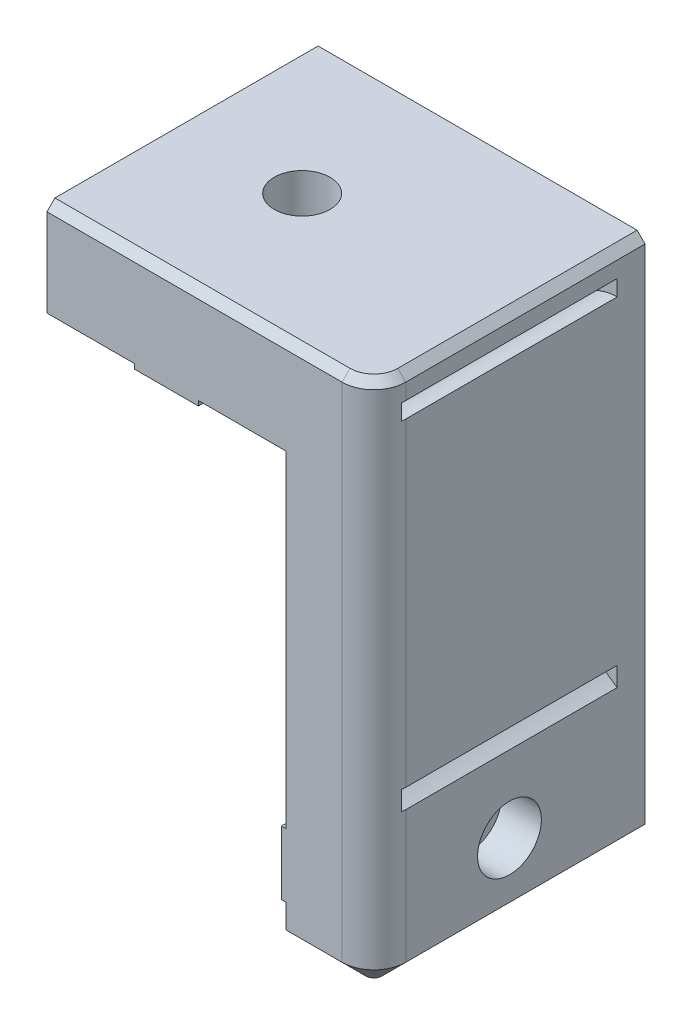
ISO-10303-21;
HEADER;
FILE_DESCRIPTION(('STEP AP214'),'2;1');
FILE_NAME('part.step','',(''),(''),'','','');
FILE_SCHEMA(('AUTOMOTIVE_DESIGN { 1 0 10303 214 1 1 1 1 }'));
ENDSEC;
DATA;
#1=APPLICATION_CONTEXT('core data for automotive mechanical design processes');
#2=APPLICATION_PROTOCOL_DEFINITION('international standard','automotive_design',2000,#1);
#3=PRODUCT_CONTEXT('',#1,'mechanical');
#4=PRODUCT('Part','Part','',(#3));
#5=PRODUCT_RELATED_PRODUCT_CATEGORY('part','',(#4));
#6=PRODUCT_DEFINITION_FORMATION('','',#4);
#7=PRODUCT_DEFINITION_CONTEXT('part definition',#1,'design');
#8=PRODUCT_DEFINITION('design','',#6,#7);
#9=PRODUCT_DEFINITION_SHAPE('','',#8);
#10=(LENGTH_UNIT() NAMED_UNIT(*) SI_UNIT(.MILLI.,.METRE.));
#11=(NAMED_UNIT(*) PLANE_ANGLE_UNIT() SI_UNIT($,.RADIAN.));
#12=(NAMED_UNIT(*) SI_UNIT($,.STERADIAN.) SOLID_ANGLE_UNIT());
#13=UNCERTAINTY_MEASURE_WITH_UNIT(LENGTH_MEASURE(1.E-05),#10,'distance_accuracy_value','');
#14=(GEOMETRIC_REPRESENTATION_CONTEXT(3) GLOBAL_UNCERTAINTY_ASSIGNED_CONTEXT((#13)) GLOBAL_UNIT_ASSIGNED_CONTEXT((#10,
#11,#12)) REPRESENTATION_CONTEXT('',''));
#15=CARTESIAN_POINT('',(0.,0.,0.));
#16=DIRECTION('',(0.,0.,1.));
#17=DIRECTION('',(1.,0.,0.));
#18=AXIS2_PLACEMENT_3D('',#15,#16,#17);
#19=CARTESIAN_POINT('',(-35.5,10.,0.));
#20=DIRECTION('',(1.,0.,0.));
#21=DIRECTION('',(0.,0.,-1.));
#22=AXIS2_PLACEMENT_3D('',#19,#20,#21);
#23=CYLINDRICAL_SURFACE('',#22,2.25);
#24=CARTESIAN_POINT('',(-6.1,10.,0.));
#25=DIRECTION('',(-1.,0.,0.));
#26=DIRECTION('',(0.,-1.,0.));
#27=AXIS2_PLACEMENT_3D('',#24,#25,#26);
#28=CIRCLE('',#27,2.25);
#29=CARTESIAN_POINT('',(-6.1,7.75,0.));
#30=VERTEX_POINT('',#29);
#31=EDGE_CURVE('E433',#30,#30,#28,.T.);
#32=ORIENTED_EDGE('',*,*,#31,.T.);
#33=EDGE_LOOP('',(#32));
#34=FACE_BOUND('',#33,.T.);
#35=CARTESIAN_POINT('',(0.5,10.,0.));
#36=DIRECTION('',(1.,0.,0.));
#37=DIRECTION('',(0.,0.,-1.));
#38=AXIS2_PLACEMENT_3D('',#35,#36,#37);
#39=CIRCLE('',#38,2.25);
#40=CARTESIAN_POINT('',(0.5,10.,-2.25));
#41=VERTEX_POINT('',#40);
#42=EDGE_CURVE('E38',#41,#41,#39,.F.);
#43=ORIENTED_EDGE('',*,*,#42,.F.);
#44=EDGE_LOOP('',(#43));
#45=FACE_BOUND('',#44,.T.);
#46=ADVANCED_FACE('F34',(#34,#45),#23,.F.);
#47=CARTESIAN_POINT('',(-20.5,0.,0.));
#48=DIRECTION('',(0.,1.,0.));
#49=DIRECTION('',(0.,0.,1.));
#50=AXIS2_PLACEMENT_3D('',#47,#48,#49);
#51=CYLINDRICAL_SURFACE('',#50,2.25);
#52=CARTESIAN_POINT('',(-20.5,54.4,0.));
#53=DIRECTION('',(0.,-1.,0.));
#54=DIRECTION('',(0.,0.,-1.));
#55=AXIS2_PLACEMENT_3D('',#52,#53,#54);
#56=CIRCLE('',#55,2.25);
#57=CARTESIAN_POINT('',(-20.5,54.4,-2.25));
#58=VERTEX_POINT('',#57);
#59=EDGE_CURVE('E241',#58,#58,#56,.T.);
#60=ORIENTED_EDGE('',*,*,#59,.T.);
#61=EDGE_LOOP('',(#60));
#62=FACE_BOUND('',#61,.T.);
#63=CARTESIAN_POINT('',(-20.5,61.,0.));
#64=DIRECTION('',(0.,1.,0.));
#65=DIRECTION('',(0.,0.,1.));
#66=AXIS2_PLACEMENT_3D('',#63,#64,#65);
#67=CIRCLE('',#66,2.25);
#68=CARTESIAN_POINT('',(-20.5,61.,2.25));
#69=VERTEX_POINT('',#68);
#70=EDGE_CURVE('E468',#69,#69,#67,.F.);
#71=ORIENTED_EDGE('',*,*,#70,.F.);
#72=EDGE_LOOP('',(#71));
#73=FACE_BOUND('',#72,.T.);
#74=ADVANCED_FACE('F560',(#62,#73),#51,.F.);
#75=CARTESIAN_POINT('',(-5.5,67.,-17.));
#76=DIRECTION('',(1.,0.,0.));
#77=DIRECTION('',(0.,0.,-1.));
#78=AXIS2_PLACEMENT_3D('',#75,#76,#77);
#79=PLANE('',#78);
#80=DIRECTION('',(0.,0.,1.));
#81=VECTOR('',#80,1.);
#82=CARTESIAN_POINT('',(-5.5,0.,-17.));
#83=LINE('',#82,#81);
#84=CARTESIAN_POINT('',(-5.5,0.,-17.));
#85=VERTEX_POINT('',#84);
#86=CARTESIAN_POINT('',(-5.5,0.,14.));
#87=VERTEX_POINT('',#86);
#88=EDGE_CURVE('E886',#85,#87,#83,.T.);
#89=ORIENTED_EDGE('',*,*,#88,.T.);
#90=DIRECTION('',(0.,-0.707106781186547,-0.707106781186548));
#91=VECTOR('',#90,1.);
#92=CARTESIAN_POINT('',(-5.5,3.,17.));
#93=LINE('',#92,#91);
#94=CARTESIAN_POINT('',(-5.5,3.,17.));
#95=VERTEX_POINT('',#94);
#96=EDGE_CURVE('E421',#87,#95,#93,.F.);
#97=ORIENTED_EDGE('',*,*,#96,.T.);
#98=DIRECTION('',(0.,-1.,0.));
#99=VECTOR('',#98,1.);
#100=CARTESIAN_POINT('',(-5.5,67.,17.));
#101=LINE('',#100,#99);
#102=CARTESIAN_POINT('',(-5.5,6.00000000000001,17.));
#103=VERTEX_POINT('',#102);
#104=EDGE_CURVE('E391',#103,#95,#101,.T.);
#105=ORIENTED_EDGE('',*,*,#104,.F.);
#106=DIRECTION('',(0.,0.,1.));
#107=VECTOR('',#106,1.);
#108=CARTESIAN_POINT('',(-5.5,6.,-25.0224684480526));
#109=LINE('',#108,#107);
#110=CARTESIAN_POINT('',(-5.5,6.,-17.));
#111=VERTEX_POINT('',#110);
#112=EDGE_CURVE('E307',#111,#103,#109,.T.);
#113=ORIENTED_EDGE('',*,*,#112,.F.);
#114=DIRECTION('',(0.,-1.,0.));
#115=VECTOR('',#114,1.);
#116=CARTESIAN_POINT('',(-5.5,67.,-17.));
#117=LINE('',#116,#115);
#118=EDGE_CURVE('E388',#111,#85,#117,.T.);
#119=ORIENTED_EDGE('',*,*,#118,.T.);
#120=EDGE_LOOP('',(#89,#97,#105,#113,#119));
#121=FACE_BOUND('',#120,.T.);
#122=ADVANCED_FACE('F566',(#121),#79,.F.);
#123=CARTESIAN_POINT('',(-35.5,55.,-17.));
#124=DIRECTION('',(0.,1.,0.));
#125=DIRECTION('',(0.,0.,1.));
#126=AXIS2_PLACEMENT_3D('',#123,#124,#125);
#127=PLANE('',#126);
#128=DIRECTION('',(1.,0.,0.));
#129=VECTOR('',#128,1.);
#130=CARTESIAN_POINT('',(-35.5,55.,-17.));
#131=LINE('',#130,#129);
#132=CARTESIAN_POINT('',(-35.5,55.,-17.));
#133=VERTEX_POINT('',#132);
#134=CARTESIAN_POINT('',(-24.5,55.,-17.));
#135=VERTEX_POINT('',#134);
#136=EDGE_CURVE('E381',#133,#135,#131,.T.);
#137=ORIENTED_EDGE('',*,*,#136,.T.);
#138=DIRECTION('',(0.,0.,1.));
#139=VECTOR('',#138,1.);
#140=CARTESIAN_POINT('',(-24.5,55.,-25.0224684480526));
#141=LINE('',#140,#139);
#142=CARTESIAN_POINT('',(-24.5,55.,17.));
#143=VERTEX_POINT('',#142);
#144=EDGE_CURVE('E332',#135,#143,#141,.T.);
#145=ORIENTED_EDGE('',*,*,#144,.T.);
#146=DIRECTION('',(1.,0.,0.));
#147=VECTOR('',#146,1.);
#148=CARTESIAN_POINT('',(-35.5,55.,17.));
#149=LINE('',#148,#147);
#150=CARTESIAN_POINT('',(-35.5,55.,17.));
#151=VERTEX_POINT('',#150);
#152=EDGE_CURVE('E375',#151,#143,#149,.T.);
#153=ORIENTED_EDGE('',*,*,#152,.F.);
#154=DIRECTION('',(0.,0.,1.));
#155=VECTOR('',#154,1.);
#156=CARTESIAN_POINT('',(-35.5,55.,-17.));
#157=LINE('',#156,#155);
#158=EDGE_CURVE('E357',#133,#151,#157,.T.);
#159=ORIENTED_EDGE('',*,*,#158,.F.);
#160=EDGE_LOOP('',(#137,#145,#153,#159));
#161=FACE_BOUND('',#160,.T.);
#162=ADVANCED_FACE('F668',(#161),#127,.F.);
#163=CARTESIAN_POINT('',(-5.5,55.,-17.));
#164=VERTEX_POINT('',#163);
#165=CARTESIAN_POINT('',(-5.5,14.,-17.));
#166=VERTEX_POINT('',#165);
#167=EDGE_CURVE('E372',#164,#166,#117,.T.);
#168=ORIENTED_EDGE('',*,*,#167,.T.);
#169=DIRECTION('',(0.,0.,1.));
#170=VECTOR('',#169,1.);
#171=CARTESIAN_POINT('',(-5.5,14.,-25.0224684480526));
#172=LINE('',#171,#170);
#173=CARTESIAN_POINT('',(-5.5,14.,17.));
#174=VERTEX_POINT('',#173);
#175=EDGE_CURVE('E318',#166,#174,#172,.T.);
#176=ORIENTED_EDGE('',*,*,#175,.T.);
#177=CARTESIAN_POINT('',(-5.5,55.,17.));
#178=VERTEX_POINT('',#177);
#179=EDGE_CURVE('E401',#178,#174,#101,.T.);
#180=ORIENTED_EDGE('',*,*,#179,.F.);
#181=DIRECTION('',(0.,0.,1.));
#182=VECTOR('',#181,1.);
#183=CARTESIAN_POINT('',(-5.5,55.,-17.));
#184=LINE('',#183,#182);
#185=EDGE_CURVE('E353',#164,#178,#184,.T.);
#186=ORIENTED_EDGE('',*,*,#185,.F.);
#187=EDGE_LOOP('',(#168,#176,#180,#186));
#188=FACE_BOUND('',#187,.T.);
#189=ADVANCED_FACE('F524',(#188),#79,.F.);
#190=CARTESIAN_POINT('',(-5.5,67.,17.));
#191=DIRECTION('',(0.,0.,-1.));
#192=DIRECTION('',(-1.,0.,0.));
#193=AXIS2_PLACEMENT_3D('',#190,#191,#192);
#194=PLANE('',#193);
#195=DIRECTION('',(0.,-1.,0.));
#196=VECTOR('',#195,1.);
#197=CARTESIAN_POINT('',(1.5,67.,17.));
#198=LINE('',#197,#196);
#199=CARTESIAN_POINT('',(1.5,3.,17.));
#200=VERTEX_POINT('',#199);
#201=CARTESIAN_POINT('',(1.5,66.,17.));
#202=VERTEX_POINT('',#201);
#203=EDGE_CURVE('E426',#200,#202,#198,.F.);
#204=ORIENTED_EDGE('',*,*,#203,.T.);
#205=DIRECTION('',(-1.,0.,0.));
#206=VECTOR('',#205,1.);
#207=CARTESIAN_POINT('',(-35.5,66.,17.));
#208=LINE('',#207,#206);
#209=CARTESIAN_POINT('',(-35.5,66.,17.));
#210=VERTEX_POINT('',#209);
#211=EDGE_CURVE('E43',#202,#210,#208,.T.);
#212=ORIENTED_EDGE('',*,*,#211,.T.);
#213=DIRECTION('',(0.,1.,0.));
#214=VECTOR('',#213,1.);
#215=CARTESIAN_POINT('',(-35.5,67.,17.));
#216=LINE('',#215,#214);
#217=EDGE_CURVE('E359',#151,#210,#216,.T.);
#218=ORIENTED_EDGE('',*,*,#217,.F.);
#219=ORIENTED_EDGE('',*,*,#152,.T.);
#220=DIRECTION('',(0.,-1.,0.));
#221=VECTOR('',#220,1.);
#222=CARTESIAN_POINT('',(-24.5,55.,17.));
#223=LINE('',#222,#221);
#224=CARTESIAN_POINT('',(-24.5,54.4,17.));
#225=VERTEX_POINT('',#224);
#226=EDGE_CURVE('E328',#143,#225,#223,.T.);
#227=ORIENTED_EDGE('',*,*,#226,.T.);
#228=DIRECTION('',(1.,0.,0.));
#229=VECTOR('',#228,1.);
#230=CARTESIAN_POINT('',(-24.5,54.4,17.));
#231=LINE('',#230,#229);
#232=CARTESIAN_POINT('',(-16.5,54.4,17.));
#233=VERTEX_POINT('',#232);
#234=EDGE_CURVE('E338',#225,#233,#231,.T.);
#235=ORIENTED_EDGE('',*,*,#234,.T.);
#236=DIRECTION('',(0.,1.,0.));
#237=VECTOR('',#236,1.);
#238=CARTESIAN_POINT('',(-16.5,55.,17.));
#239=LINE('',#238,#237);
#240=CARTESIAN_POINT('',(-16.5,55.,17.));
#241=VERTEX_POINT('',#240);
#242=EDGE_CURVE('E341',#233,#241,#239,.T.);
#243=ORIENTED_EDGE('',*,*,#242,.T.);
#244=EDGE_CURVE('E363',#241,#178,#149,.T.);
#245=ORIENTED_EDGE('',*,*,#244,.T.);
#246=ORIENTED_EDGE('',*,*,#179,.T.);
#247=DIRECTION('',(-1.,0.,0.));
#248=VECTOR('',#247,1.);
#249=CARTESIAN_POINT('',(-5.5,14.,17.));
#250=LINE('',#249,#248);
#251=CARTESIAN_POINT('',(-6.1,14.,17.));
#252=VERTEX_POINT('',#251);
#253=EDGE_CURVE('E302',#174,#252,#250,.T.);
#254=ORIENTED_EDGE('',*,*,#253,.T.);
#255=DIRECTION('',(0.,-1.,0.));
#256=VECTOR('',#255,1.);
#257=CARTESIAN_POINT('',(-6.1,14.,17.));
#258=LINE('',#257,#256);
#259=CARTESIAN_POINT('',(-6.1,6.,17.));
#260=VERTEX_POINT('',#259);
#261=EDGE_CURVE('E312',#252,#260,#258,.T.);
#262=ORIENTED_EDGE('',*,*,#261,.T.);
#263=DIRECTION('',(1.,0.,0.));
#264=VECTOR('',#263,1.);
#265=CARTESIAN_POINT('',(-5.5,6.,17.));
#266=LINE('',#265,#264);
#267=EDGE_CURVE('E315',#260,#103,#266,.T.);
#268=ORIENTED_EDGE('',*,*,#267,.T.);
#269=ORIENTED_EDGE('',*,*,#104,.T.);
#270=DIRECTION('',(1.,0.,0.));
#271=VECTOR('',#270,1.);
#272=CARTESIAN_POINT('',(-5.5,3.,17.));
#273=LINE('',#272,#271);
#274=EDGE_CURVE('E413',#95,#200,#273,.T.);
#275=ORIENTED_EDGE('',*,*,#274,.T.);
#276=EDGE_LOOP('',(#204,#212,#218,#219,#227,#235,#243,#245,#246,#254,#262,#268,#269,#275));
#277=FACE_BOUND('',#276,.T.);
#278=ADVANCED_FACE('F412',(#277),#194,.F.);
#279=CARTESIAN_POINT('',(5.5,67.,-17.));
#280=DIRECTION('',(-1.,0.,0.));
#281=DIRECTION('',(0.,0.,1.));
#282=AXIS2_PLACEMENT_3D('',#279,#280,#281);
#283=PLANE('',#282);
#284=CARTESIAN_POINT('',(5.5,10.,0.));
#285=DIRECTION('',(1.,0.,0.));
#286=DIRECTION('',(0.,0.,-1.));
#287=AXIS2_PLACEMENT_3D('',#284,#285,#286);
#288=CIRCLE('',#287,4.);
#289=CARTESIAN_POINT('',(5.5,10.,-4.));
#290=VERTEX_POINT('',#289);
#291=EDGE_CURVE('E482',#290,#290,#288,.T.);
#292=ORIENTED_EDGE('',*,*,#291,.F.);
#293=EDGE_LOOP('',(#292));
#294=FACE_BOUND('',#293,.T.);
#295=DIRECTION('',(0.,-1.,0.));
#296=VECTOR('',#295,1.);
#297=CARTESIAN_POINT('',(5.5,67.,-17.));
#298=LINE('',#297,#296);
#299=CARTESIAN_POINT('',(5.5,66.,-17.));
#300=VERTEX_POINT('',#299);
#301=CARTESIAN_POINT('',(5.5,3.,-17.));
#302=VERTEX_POINT('',#301);
#303=EDGE_CURVE('E398',#300,#302,#298,.T.);
#304=ORIENTED_EDGE('',*,*,#303,.F.);
#305=DIRECTION('',(0.,0.,1.));
#306=VECTOR('',#305,1.);
#307=CARTESIAN_POINT('',(5.5,66.,13.));
#308=LINE('',#307,#306);
#309=CARTESIAN_POINT('',(5.5,66.,13.));
#310=VERTEX_POINT('',#309);
#311=EDGE_CURVE('E461',#300,#310,#308,.T.);
#312=ORIENTED_EDGE('',*,*,#311,.T.);
#313=DIRECTION('',(0.,-1.,0.));
#314=VECTOR('',#313,1.);
#315=CARTESIAN_POINT('',(5.5,67.,13.));
#316=LINE('',#315,#314);
#317=CARTESIAN_POINT('',(5.5,64.,13.));
#318=VERTEX_POINT('',#317);
#319=EDGE_CURVE('E539',#310,#318,#316,.T.);
#320=ORIENTED_EDGE('',*,*,#319,.T.);
#321=DIRECTION('',(0.,0.,1.));
#322=VECTOR('',#321,1.);
#323=CARTESIAN_POINT('',(5.5,64.,13.5));
#324=LINE('',#323,#322);
#325=CARTESIAN_POINT('',(5.5,64.,-13.5));
#326=VERTEX_POINT('',#325);
#327=EDGE_CURVE('E256',#326,#318,#324,.T.);
#328=ORIENTED_EDGE('',*,*,#327,.F.);
#329=DIRECTION('',(0.,1.,0.));
#330=VECTOR('',#329,1.);
#331=CARTESIAN_POINT('',(5.5,62.,-13.5));
#332=LINE('',#331,#330);
#333=CARTESIAN_POINT('',(5.5,62.,-13.5));
#334=VERTEX_POINT('',#333);
#335=EDGE_CURVE('E240',#334,#326,#332,.T.);
#336=ORIENTED_EDGE('',*,*,#335,.F.);
#337=DIRECTION('',(0.,0.,-1.));
#338=VECTOR('',#337,1.);
#339=CARTESIAN_POINT('',(5.5,62.,13.5));
#340=LINE('',#339,#338);
#341=CARTESIAN_POINT('',(5.5,62.,13.));
#342=VERTEX_POINT('',#341);
#343=EDGE_CURVE('E228',#342,#334,#340,.T.);
#344=ORIENTED_EDGE('',*,*,#343,.F.);
#345=DIRECTION('',(0.,-1.,0.));
#346=VECTOR('',#345,1.);
#347=CARTESIAN_POINT('',(5.5,67.,13.));
#348=LINE('',#347,#346);
#349=CARTESIAN_POINT('',(5.5,22.,13.));
#350=VERTEX_POINT('',#349);
#351=EDGE_CURVE('E408',#342,#350,#348,.T.);
#352=ORIENTED_EDGE('',*,*,#351,.T.);
#353=DIRECTION('',(0.,0.,1.));
#354=VECTOR('',#353,1.);
#355=CARTESIAN_POINT('',(5.5,22.,0.));
#356=LINE('',#355,#354);
#357=CARTESIAN_POINT('',(5.5,22.,-13.5));
#358=VERTEX_POINT('',#357);
#359=EDGE_CURVE('E303',#358,#350,#356,.T.);
#360=ORIENTED_EDGE('',*,*,#359,.F.);
#361=DIRECTION('',(0.,1.,0.));
#362=VECTOR('',#361,1.);
#363=CARTESIAN_POINT('',(5.5,34.,-13.5));
#364=LINE('',#363,#362);
#365=CARTESIAN_POINT('',(5.5,19.577794898144,-13.5));
#366=VERTEX_POINT('',#365);
#367=EDGE_CURVE('E299',#366,#358,#364,.T.);
#368=ORIENTED_EDGE('',*,*,#367,.F.);
#369=DIRECTION('',(0.,0.,1.));
#370=VECTOR('',#369,1.);
#371=CARTESIAN_POINT('',(5.5,19.577794898144,0.));
#372=LINE('',#371,#370);
#373=CARTESIAN_POINT('',(5.5,19.577794898144,13.));
#374=VERTEX_POINT('',#373);
#375=EDGE_CURVE('E300',#374,#366,#372,.F.);
#376=ORIENTED_EDGE('',*,*,#375,.F.);
#377=DIRECTION('',(0.,-1.,0.));
#378=VECTOR('',#377,1.);
#379=CARTESIAN_POINT('',(5.5,67.,13.));
#380=LINE('',#379,#378);
#381=CARTESIAN_POINT('',(5.5,3.,13.));
#382=VERTEX_POINT('',#381);
#383=EDGE_CURVE('E404',#374,#382,#380,.T.);
#384=ORIENTED_EDGE('',*,*,#383,.T.);
#385=DIRECTION('',(0.,0.,-1.));
#386=VECTOR('',#385,1.);
#387=CARTESIAN_POINT('',(5.5,3.,-17.));
#388=LINE('',#387,#386);
#389=EDGE_CURVE('E442',#382,#302,#388,.T.);
#390=ORIENTED_EDGE('',*,*,#389,.T.);
#391=EDGE_LOOP('',(#304,#312,#320,#328,#336,#344,#352,#360,#368,#376,#384,#390));
#392=FACE_BOUND('',#391,.T.);
#393=ADVANCED_FACE('F254',(#294,#392),#283,.F.);
#394=CARTESIAN_POINT('',(-5.5,67.,-17.));
#395=DIRECTION('',(0.,0.,1.));
#396=DIRECTION('',(1.,0.,0.));
#397=AXIS2_PLACEMENT_3D('',#394,#395,#396);
#398=PLANE('',#397);
#399=DIRECTION('',(-1.,0.,0.));
#400=VECTOR('',#399,1.);
#401=CARTESIAN_POINT('',(-5.5,67.,-17.));
#402=LINE('',#401,#400);
#403=CARTESIAN_POINT('',(4.49999999999999,67.,-17.));
#404=VERTEX_POINT('',#403);
#405=CARTESIAN_POINT('',(-35.5,67.,-17.));
#406=VERTEX_POINT('',#405);
#407=EDGE_CURVE('E366',#404,#406,#402,.T.);
#408=ORIENTED_EDGE('',*,*,#407,.F.);
#409=DIRECTION('',(0.707106781186547,-0.707106781186548,0.));
#410=VECTOR('',#409,1.);
#411=CARTESIAN_POINT('',(4.5,67.,-17.));
#412=LINE('',#411,#410);
#413=EDGE_CURVE('E459',#404,#300,#412,.T.);
#414=ORIENTED_EDGE('',*,*,#413,.T.);
#415=ORIENTED_EDGE('',*,*,#303,.T.);
#416=DIRECTION('',(0.707106781186548,0.707106781186547,0.));
#417=VECTOR('',#416,1.);
#418=CARTESIAN_POINT('',(5.5,3.,-17.));
#419=LINE('',#418,#417);
#420=CARTESIAN_POINT('',(2.49999999999999,0.,-17.));
#421=VERTEX_POINT('',#420);
#422=EDGE_CURVE('E445',#302,#421,#419,.F.);
#423=ORIENTED_EDGE('',*,*,#422,.T.);
#424=DIRECTION('',(-1.,0.,0.));
#425=VECTOR('',#424,1.);
#426=CARTESIAN_POINT('',(-5.5,0.,-17.));
#427=LINE('',#426,#425);
#428=EDGE_CURVE('E397',#421,#85,#427,.T.);
#429=ORIENTED_EDGE('',*,*,#428,.T.);
#430=ORIENTED_EDGE('',*,*,#118,.F.);
#431=DIRECTION('',(-1.,0.,0.));
#432=VECTOR('',#431,1.);
#433=CARTESIAN_POINT('',(-5.5,6.,-17.));
#434=LINE('',#433,#432);
#435=CARTESIAN_POINT('',(-6.1,6.,-17.));
#436=VERTEX_POINT('',#435);
#437=EDGE_CURVE('E306',#111,#436,#434,.T.);
#438=ORIENTED_EDGE('',*,*,#437,.T.);
#439=DIRECTION('',(0.,1.,0.));
#440=VECTOR('',#439,1.);
#441=CARTESIAN_POINT('',(-6.1,14.,-17.));
#442=LINE('',#441,#440);
#443=CARTESIAN_POINT('',(-6.1,14.,-17.));
#444=VERTEX_POINT('',#443);
#445=EDGE_CURVE('E304',#436,#444,#442,.T.);
#446=ORIENTED_EDGE('',*,*,#445,.T.);
#447=DIRECTION('',(1.,0.,0.));
#448=VECTOR('',#447,1.);
#449=CARTESIAN_POINT('',(-5.5,14.,-17.));
#450=LINE('',#449,#448);
#451=EDGE_CURVE('E309',#444,#166,#450,.T.);
#452=ORIENTED_EDGE('',*,*,#451,.T.);
#453=ORIENTED_EDGE('',*,*,#167,.F.);
#454=CARTESIAN_POINT('',(-16.5,55.,-17.));
#455=VERTEX_POINT('',#454);
#456=EDGE_CURVE('E378',#455,#164,#131,.T.);
#457=ORIENTED_EDGE('',*,*,#456,.F.);
#458=DIRECTION('',(0.,-1.,0.));
#459=VECTOR('',#458,1.);
#460=CARTESIAN_POINT('',(-16.5,55.,-17.));
#461=LINE('',#460,#459);
#462=CARTESIAN_POINT('',(-16.5,54.4,-17.));
#463=VERTEX_POINT('',#462);
#464=EDGE_CURVE('E329',#455,#463,#461,.T.);
#465=ORIENTED_EDGE('',*,*,#464,.T.);
#466=DIRECTION('',(-1.,0.,0.));
#467=VECTOR('',#466,1.);
#468=CARTESIAN_POINT('',(-24.5,54.4,-17.));
#469=LINE('',#468,#467);
#470=CARTESIAN_POINT('',(-24.5,54.4,-17.));
#471=VERTEX_POINT('',#470);
#472=EDGE_CURVE('E335',#463,#471,#469,.T.);
#473=ORIENTED_EDGE('',*,*,#472,.T.);
#474=DIRECTION('',(0.,1.,0.));
#475=VECTOR('',#474,1.);
#476=CARTESIAN_POINT('',(-24.5,55.,-17.));
#477=LINE('',#476,#475);
#478=EDGE_CURVE('E331',#471,#135,#477,.T.);
#479=ORIENTED_EDGE('',*,*,#478,.T.);
#480=ORIENTED_EDGE('',*,*,#136,.F.);
#481=DIRECTION('',(0.,-1.,0.));
#482=VECTOR('',#481,1.);
#483=CARTESIAN_POINT('',(-35.5,67.,-17.));
#484=LINE('',#483,#482);
#485=EDGE_CURVE('E354',#406,#133,#484,.T.);
#486=ORIENTED_EDGE('',*,*,#485,.F.);
#487=EDGE_LOOP('',(#408,#414,#415,#423,#429,#430,#438,#446,#452,#453,#457,#465,#473,#479,#480,#486));
#488=FACE_BOUND('',#487,.T.);
#489=ADVANCED_FACE('F718',(#488),#398,.F.);
#490=CARTESIAN_POINT('',(0.,67.,0.));
#491=DIRECTION('',(0.,1.,0.));
#492=DIRECTION('',(0.,0.,1.));
#493=AXIS2_PLACEMENT_3D('',#490,#491,#492);
#494=PLANE('',#493);
#495=CARTESIAN_POINT('',(-20.5,67.,0.));
#496=DIRECTION('',(0.,1.,0.));
#497=DIRECTION('',(0.,0.,1.));
#498=AXIS2_PLACEMENT_3D('',#495,#496,#497);
#499=CIRCLE('',#498,3.5);
#500=CARTESIAN_POINT('',(-20.5,67.,3.5));
#501=VERTEX_POINT('',#500);
#502=EDGE_CURVE('E475',#501,#501,#499,.T.);
#503=ORIENTED_EDGE('',*,*,#502,.F.);
#504=EDGE_LOOP('',(#503));
#505=FACE_BOUND('',#504,.T.);
#506=CARTESIAN_POINT('',(1.5,67.,13.));
#507=DIRECTION('',(0.,1.,0.));
#508=DIRECTION('',(0.,0.,1.));
#509=AXIS2_PLACEMENT_3D('',#506,#507,#508);
#510=CIRCLE('',#509,3.);
#511=CARTESIAN_POINT('',(1.5,67.,16.));
#512=VERTEX_POINT('',#511);
#513=CARTESIAN_POINT('',(4.5,67.,13.));
#514=VERTEX_POINT('',#513);
#515=EDGE_CURVE('E454',#512,#514,#510,.T.);
#516=ORIENTED_EDGE('',*,*,#515,.T.);
#517=DIRECTION('',(0.,0.,-1.));
#518=VECTOR('',#517,1.);
#519=CARTESIAN_POINT('',(4.5,67.,-17.));
#520=LINE('',#519,#518);
#521=EDGE_CURVE('E456',#514,#404,#520,.T.);
#522=ORIENTED_EDGE('',*,*,#521,.T.);
#523=ORIENTED_EDGE('',*,*,#407,.T.);
#524=DIRECTION('',(0.,0.,-1.));
#525=VECTOR('',#524,1.);
#526=CARTESIAN_POINT('',(-35.5,67.,-17.));
#527=LINE('',#526,#525);
#528=CARTESIAN_POINT('',(-35.5,67.,16.));
#529=VERTEX_POINT('',#528);
#530=EDGE_CURVE('E361',#529,#406,#527,.T.);
#531=ORIENTED_EDGE('',*,*,#530,.F.);
#532=DIRECTION('',(1.,0.,0.));
#533=VECTOR('',#532,1.);
#534=CARTESIAN_POINT('',(1.5,67.,16.));
#535=LINE('',#534,#533);
#536=EDGE_CURVE('E447',#529,#512,#535,.T.);
#537=ORIENTED_EDGE('',*,*,#536,.T.);
#538=EDGE_LOOP('',(#516,#522,#523,#531,#537));
#539=FACE_BOUND('',#538,.T.);
#540=ADVANCED_FACE('F714',(#505,#539),#494,.T.);
#541=CARTESIAN_POINT('',(0.,0.,0.));
#542=DIRECTION('',(0.,1.,0.));
#543=DIRECTION('',(0.,0.,1.));
#544=AXIS2_PLACEMENT_3D('',#541,#542,#543);
#545=PLANE('',#544);
#546=CARTESIAN_POINT('',(1.5,0.,13.));
#547=DIRECTION('',(0.,1.,0.));
#548=DIRECTION('',(0.,0.,1.));
#549=AXIS2_PLACEMENT_3D('',#546,#547,#548);
#550=CIRCLE('',#549,0.99999999999999);
#551=CARTESIAN_POINT('',(2.49999999999999,0.,13.));
#552=VERTEX_POINT('',#551);
#553=CARTESIAN_POINT('',(1.5,0.,14.));
#554=VERTEX_POINT('',#553);
#555=EDGE_CURVE('E428',#552,#554,#550,.F.);
#556=ORIENTED_EDGE('',*,*,#555,.T.);
#557=DIRECTION('',(-1.,0.,0.));
#558=VECTOR('',#557,1.);
#559=CARTESIAN_POINT('',(0.,0.,14.));
#560=LINE('',#559,#558);
#561=EDGE_CURVE('E437',#554,#87,#560,.T.);
#562=ORIENTED_EDGE('',*,*,#561,.T.);
#563=ORIENTED_EDGE('',*,*,#88,.F.);
#564=ORIENTED_EDGE('',*,*,#428,.F.);
#565=DIRECTION('',(0.,0.,1.));
#566=VECTOR('',#565,1.);
#567=CARTESIAN_POINT('',(2.49999999999999,0.,0.));
#568=LINE('',#567,#566);
#569=EDGE_CURVE('E425',#421,#552,#568,.T.);
#570=ORIENTED_EDGE('',*,*,#569,.T.);
#571=EDGE_LOOP('',(#556,#562,#563,#564,#570));
#572=FACE_BOUND('',#571,.T.);
#573=ADVANCED_FACE('F665',(#572),#545,.F.);
#574=ORIENTED_EDGE('',*,*,#244,.F.);
#575=DIRECTION('',(0.,0.,1.));
#576=VECTOR('',#575,1.);
#577=CARTESIAN_POINT('',(-16.5,55.,-25.0224684480526));
#578=LINE('',#577,#576);
#579=EDGE_CURVE('E346',#455,#241,#578,.T.);
#580=ORIENTED_EDGE('',*,*,#579,.F.);
#581=ORIENTED_EDGE('',*,*,#456,.T.);
#582=ORIENTED_EDGE('',*,*,#185,.T.);
#583=EDGE_LOOP('',(#574,#580,#581,#582));
#584=FACE_BOUND('',#583,.T.);
#585=ADVANCED_FACE('F660',(#584),#127,.F.);
#586=CARTESIAN_POINT('',(-35.5,0.,0.));
#587=DIRECTION('',(-1.,0.,0.));
#588=DIRECTION('',(0.,0.,1.));
#589=AXIS2_PLACEMENT_3D('',#586,#587,#588);
#590=PLANE('',#589);
#591=ORIENTED_EDGE('',*,*,#217,.T.);
#592=DIRECTION('',(0.,0.707106781186548,-0.707106781186548));
#593=VECTOR('',#592,1.);
#594=CARTESIAN_POINT('',(-35.5,41.5,41.5));
#595=LINE('',#594,#593);
#596=EDGE_CURVE('E11',#210,#529,#595,.T.);
#597=ORIENTED_EDGE('',*,*,#596,.T.);
#598=ORIENTED_EDGE('',*,*,#530,.T.);
#599=ORIENTED_EDGE('',*,*,#485,.T.);
#600=ORIENTED_EDGE('',*,*,#158,.T.);
#601=EDGE_LOOP('',(#591,#597,#598,#599,#600));
#602=FACE_BOUND('',#601,.T.);
#603=ADVANCED_FACE('F652',(#602),#590,.T.);
#604=CARTESIAN_POINT('',(-24.5,55.,-25.0224684480526));
#605=DIRECTION('',(-1.,0.,0.));
#606=DIRECTION('',(0.,0.,1.));
#607=AXIS2_PLACEMENT_3D('',#604,#605,#606);
#608=PLANE('',#607);
#609=ORIENTED_EDGE('',*,*,#478,.F.);
#610=DIRECTION('',(0.,0.,1.));
#611=VECTOR('',#610,1.);
#612=CARTESIAN_POINT('',(-24.5,54.4,-25.0224684480526));
#613=LINE('',#612,#611);
#614=EDGE_CURVE('E344',#471,#225,#613,.T.);
#615=ORIENTED_EDGE('',*,*,#614,.T.);
#616=ORIENTED_EDGE('',*,*,#226,.F.);
#617=ORIENTED_EDGE('',*,*,#144,.F.);
#618=EDGE_LOOP('',(#609,#615,#616,#617));
#619=FACE_BOUND('',#618,.T.);
#620=ADVANCED_FACE('F642',(#619),#608,.T.);
#621=CARTESIAN_POINT('',(-16.5,55.,-25.0224684480526));
#622=DIRECTION('',(1.,0.,0.));
#623=DIRECTION('',(0.,0.,-1.));
#624=AXIS2_PLACEMENT_3D('',#621,#622,#623);
#625=PLANE('',#624);
#626=ORIENTED_EDGE('',*,*,#464,.F.);
#627=ORIENTED_EDGE('',*,*,#579,.T.);
#628=ORIENTED_EDGE('',*,*,#242,.F.);
#629=DIRECTION('',(0.,0.,1.));
#630=VECTOR('',#629,1.);
#631=CARTESIAN_POINT('',(-16.5,54.4,-25.0224684480526));
#632=LINE('',#631,#630);
#633=EDGE_CURVE('E349',#463,#233,#632,.T.);
#634=ORIENTED_EDGE('',*,*,#633,.F.);
#635=EDGE_LOOP('',(#626,#627,#628,#634));
#636=FACE_BOUND('',#635,.T.);
#637=ADVANCED_FACE('F637',(#636),#625,.T.);
#638=CARTESIAN_POINT('',(-24.5,54.4,-25.0224684480526));
#639=DIRECTION('',(0.,-1.,0.));
#640=DIRECTION('',(0.,0.,-1.));
#641=AXIS2_PLACEMENT_3D('',#638,#639,#640);
#642=PLANE('',#641);
#643=ORIENTED_EDGE('',*,*,#59,.F.);
#644=EDGE_LOOP('',(#643));
#645=FACE_BOUND('',#644,.T.);
#646=ORIENTED_EDGE('',*,*,#472,.F.);
#647=ORIENTED_EDGE('',*,*,#633,.T.);
#648=ORIENTED_EDGE('',*,*,#234,.F.);
#649=ORIENTED_EDGE('',*,*,#614,.F.);
#650=EDGE_LOOP('',(#646,#647,#648,#649));
#651=FACE_BOUND('',#650,.T.);
#652=ADVANCED_FACE('F629',(#645,#651),#642,.T.);
#653=CARTESIAN_POINT('',(-5.5,6.,-25.0224684480526));
#654=DIRECTION('',(0.,-1.,0.));
#655=DIRECTION('',(0.,0.,-1.));
#656=AXIS2_PLACEMENT_3D('',#653,#654,#655);
#657=PLANE('',#656);
#658=ORIENTED_EDGE('',*,*,#437,.F.);
#659=ORIENTED_EDGE('',*,*,#112,.T.);
#660=ORIENTED_EDGE('',*,*,#267,.F.);
#661=DIRECTION('',(0.,0.,1.));
#662=VECTOR('',#661,1.);
#663=CARTESIAN_POINT('',(-6.1,6.,-25.0224684480526));
#664=LINE('',#663,#662);
#665=EDGE_CURVE('E321',#436,#260,#664,.T.);
#666=ORIENTED_EDGE('',*,*,#665,.F.);
#667=EDGE_LOOP('',(#658,#659,#660,#666));
#668=FACE_BOUND('',#667,.T.);
#669=ADVANCED_FACE('F624',(#668),#657,.T.);
#670=CARTESIAN_POINT('',(-6.1,14.,-25.0224684480526));
#671=DIRECTION('',(-1.,0.,0.));
#672=DIRECTION('',(0.,-1.,0.));
#673=AXIS2_PLACEMENT_3D('',#670,#671,#672);
#674=PLANE('',#673);
#675=ORIENTED_EDGE('',*,*,#31,.F.);
#676=EDGE_LOOP('',(#675));
#677=FACE_BOUND('',#676,.T.);
#678=ORIENTED_EDGE('',*,*,#445,.F.);
#679=ORIENTED_EDGE('',*,*,#665,.T.);
#680=ORIENTED_EDGE('',*,*,#261,.F.);
#681=DIRECTION('',(0.,0.,1.));
#682=VECTOR('',#681,1.);
#683=CARTESIAN_POINT('',(-6.1,14.,-25.0224684480526));
#684=LINE('',#683,#682);
#685=EDGE_CURVE('E323',#444,#252,#684,.T.);
#686=ORIENTED_EDGE('',*,*,#685,.F.);
#687=EDGE_LOOP('',(#678,#679,#680,#686));
#688=FACE_BOUND('',#687,.T.);
#689=ADVANCED_FACE('F614',(#677,#688),#674,.T.);
#690=CARTESIAN_POINT('',(-5.5,14.,-25.0224684480526));
#691=DIRECTION('',(0.,1.,0.));
#692=DIRECTION('',(0.,0.,1.));
#693=AXIS2_PLACEMENT_3D('',#690,#691,#692);
#694=PLANE('',#693);
#695=ORIENTED_EDGE('',*,*,#451,.F.);
#696=ORIENTED_EDGE('',*,*,#685,.T.);
#697=ORIENTED_EDGE('',*,*,#253,.F.);
#698=ORIENTED_EDGE('',*,*,#175,.F.);
#699=EDGE_LOOP('',(#695,#696,#697,#698));
#700=FACE_BOUND('',#699,.T.);
#701=ADVANCED_FACE('F609',(#700),#694,.T.);
#702=CARTESIAN_POINT('',(14.5,34.,0.));
#703=DIRECTION('',(0.,0.,1.));
#704=DIRECTION('',(1.,0.,0.));
#705=AXIS2_PLACEMENT_3D('',#702,#703,#704);
#706=CYLINDRICAL_SURFACE('',#705,15.);
#707=ORIENTED_EDGE('',*,*,#359,.T.);
#708=CARTESIAN_POINT('',(5.5,22.,13.));
#709=CARTESIAN_POINT('',(5.49998327308072,22.0000045326232,13.0838457176371));
#710=CARTESIAN_POINT('',(5.49736049016984,22.0019729640203,13.1674352431301));
#711=CARTESIAN_POINT('',(5.48690281236686,22.009837624361,13.3341019097966));
#712=CARTESIAN_POINT('',(5.47906791747669,22.015733853303,13.4171790509703));
#713=CARTESIAN_POINT('',(5.46862696659689,22.0235939810175,13.5));
#714=B_SPLINE_CURVE_WITH_KNOTS('',3,(#708,#709,#710,#711,#712,#713),.UNSPECIFIED.,.F.,.F.,(4,2,
4),(0.,0.250961475849476,0.501922951605057),.UNSPECIFIED.);
#715=CARTESIAN_POINT('',(5.46862696659688,22.0235939810175,13.5));
#716=VERTEX_POINT('',#715);
#717=EDGE_CURVE('E490',#350,#716,#714,.T.);
#718=ORIENTED_EDGE('',*,*,#717,.T.);
#719=CARTESIAN_POINT('',(14.5,34.,13.5));
#720=DIRECTION('',(0.,0.,1.));
#721=DIRECTION('',(1.,0.,0.));
#722=AXIS2_PLACEMENT_3D('',#719,#720,#721);
#723=CIRCLE('',#722,15.);
#724=CARTESIAN_POINT('',(-0.5,34.,13.5));
#725=VERTEX_POINT('',#724);
#726=EDGE_CURVE('E287',#725,#716,#723,.T.);
#727=ORIENTED_EDGE('',*,*,#726,.F.);
#728=DIRECTION('',(0.,0.,-1.));
#729=VECTOR('',#728,1.);
#730=CARTESIAN_POINT('',(-0.5,34.,13.5));
#731=LINE('',#730,#729);
#732=CARTESIAN_POINT('',(-0.5,34.,-13.5));
#733=VERTEX_POINT('',#732);
#734=EDGE_CURVE('E271',#725,#733,#731,.T.);
#735=ORIENTED_EDGE('',*,*,#734,.T.);
#736=CARTESIAN_POINT('',(14.5,34.,-13.5));
#737=DIRECTION('',(0.,0.,1.));
#738=DIRECTION('',(1.,0.,0.));
#739=AXIS2_PLACEMENT_3D('',#736,#737,#738);
#740=CIRCLE('',#739,15.);
#741=EDGE_CURVE('E290',#733,#358,#740,.T.);
#742=ORIENTED_EDGE('',*,*,#741,.T.);
#743=EDGE_LOOP('',(#707,#718,#727,#735,#742));
#744=FACE_BOUND('',#743,.T.);
#745=ADVANCED_FACE('F489',(#744),#706,.T.);
#746=CARTESIAN_POINT('',(14.5,34.,0.));
#747=DIRECTION('',(0.,0.,1.));
#748=DIRECTION('',(1.,0.,0.));
#749=AXIS2_PLACEMENT_3D('',#746,#747,#748);
#750=CYLINDRICAL_SURFACE('',#749,17.);
#751=CARTESIAN_POINT('',(14.5,34.,13.5));
#752=DIRECTION('',(0.,0.,1.));
#753=DIRECTION('',(1.,0.,0.));
#754=AXIS2_PLACEMENT_3D('',#751,#752,#753);
#755=CIRCLE('',#754,17.);
#756=CARTESIAN_POINT('',(-2.5,34.,13.5));
#757=VERTEX_POINT('',#756);
#758=CARTESIAN_POINT('',(5.46862696659689,19.5974203306658,13.5));
#759=VERTEX_POINT('',#758);
#760=EDGE_CURVE('E296',#757,#759,#755,.T.);
#761=ORIENTED_EDGE('',*,*,#760,.T.);
#762=CARTESIAN_POINT('',(5.46862696659689,19.5974203306658,13.5));
#763=CARTESIAN_POINT('',(5.47907148634695,19.5908808043545,13.4171222263402));
#764=CARTESIAN_POINT('',(5.48690816567224,19.5859755884888,13.3340166728522));
#765=CARTESIAN_POINT('',(5.4973658434754,19.5794337776469,13.1673500061857));
#766=CARTESIAN_POINT('',(5.49998684195115,19.5777971826721,13.0837888930071));
#767=CARTESIAN_POINT('',(5.5,19.577794898144,13.));
#768=B_SPLINE_CURVE_WITH_KNOTS('',3,(#762,#763,#764,#765,#766,#767),.UNSPECIFIED.,.F.,.F.,(4,2,
4),(0.,0.250854677761449,0.501709355624887),.UNSPECIFIED.);
#769=EDGE_CURVE('E430',#759,#374,#768,.T.);
#770=ORIENTED_EDGE('',*,*,#769,.T.);
#771=ORIENTED_EDGE('',*,*,#375,.T.);
#772=CARTESIAN_POINT('',(14.5,34.,-13.5));
#773=DIRECTION('',(0.,0.,1.));
#774=DIRECTION('',(1.,0.,0.));
#775=AXIS2_PLACEMENT_3D('',#772,#773,#774);
#776=CIRCLE('',#775,17.);
#777=CARTESIAN_POINT('',(-2.5,34.,-13.5));
#778=VERTEX_POINT('',#777);
#779=EDGE_CURVE('E293',#778,#366,#776,.T.);
#780=ORIENTED_EDGE('',*,*,#779,.F.);
#781=DIRECTION('',(0.,0.,1.));
#782=VECTOR('',#781,1.);
#783=CARTESIAN_POINT('',(-2.5,34.,13.5));
#784=LINE('',#783,#782);
#785=EDGE_CURVE('E274',#778,#757,#784,.T.);
#786=ORIENTED_EDGE('',*,*,#785,.T.);
#787=EDGE_LOOP('',(#761,#770,#771,#780,#786));
#788=FACE_BOUND('',#787,.T.);
#789=ADVANCED_FACE('F553',(#788),#750,.F.);
#790=CARTESIAN_POINT('',(-2.5,56.,13.5));
#791=DIRECTION('',(1.,0.,0.));
#792=DIRECTION('',(0.,1.,0.));
#793=AXIS2_PLACEMENT_3D('',#790,#791,#792);
#794=PLANE('',#793);
#795=DIRECTION('',(0.,0.,1.));
#796=VECTOR('',#795,1.);
#797=CARTESIAN_POINT('',(-2.5,56.,13.5));
#798=LINE('',#797,#796);
#799=CARTESIAN_POINT('',(-2.5,56.,-13.5));
#800=VERTEX_POINT('',#799);
#801=CARTESIAN_POINT('',(-2.5,56.,13.5));
#802=VERTEX_POINT('',#801);
#803=EDGE_CURVE('E263',#800,#802,#798,.T.);
#804=ORIENTED_EDGE('',*,*,#803,.T.);
#805=DIRECTION('',(0.,-1.,0.));
#806=VECTOR('',#805,1.);
#807=CARTESIAN_POINT('',(-2.5,56.,13.5));
#808=LINE('',#807,#806);
#809=EDGE_CURVE('E284',#802,#757,#808,.T.);
#810=ORIENTED_EDGE('',*,*,#809,.T.);
#811=ORIENTED_EDGE('',*,*,#785,.F.);
#812=DIRECTION('',(0.,-1.,0.));
#813=VECTOR('',#812,1.);
#814=CARTESIAN_POINT('',(-2.5,56.,-13.5));
#815=LINE('',#814,#813);
#816=EDGE_CURVE('E281',#800,#778,#815,.T.);
#817=ORIENTED_EDGE('',*,*,#816,.F.);
#818=EDGE_LOOP('',(#804,#810,#811,#817));
#819=FACE_BOUND('',#818,.T.);
#820=ADVANCED_FACE('F550',(#819),#794,.T.);
#821=CARTESIAN_POINT('',(-0.5,56.,13.5));
#822=DIRECTION('',(-1.,0.,0.));
#823=DIRECTION('',(0.,-1.,0.));
#824=AXIS2_PLACEMENT_3D('',#821,#822,#823);
#825=PLANE('',#824);
#826=DIRECTION('',(0.,0.,-1.));
#827=VECTOR('',#826,1.);
#828=CARTESIAN_POINT('',(-0.5,56.,13.5));
#829=LINE('',#828,#827);
#830=CARTESIAN_POINT('',(-0.5,56.,13.5));
#831=VERTEX_POINT('',#830);
#832=CARTESIAN_POINT('',(-0.5,56.,-13.5));
#833=VERTEX_POINT('',#832);
#834=EDGE_CURVE('E258',#831,#833,#829,.T.);
#835=ORIENTED_EDGE('',*,*,#834,.T.);
#836=DIRECTION('',(0.,-1.,0.));
#837=VECTOR('',#836,1.);
#838=CARTESIAN_POINT('',(-0.5,56.,-13.5));
#839=LINE('',#838,#837);
#840=EDGE_CURVE('E249',#833,#733,#839,.T.);
#841=ORIENTED_EDGE('',*,*,#840,.T.);
#842=ORIENTED_EDGE('',*,*,#734,.F.);
#843=DIRECTION('',(0.,-1.,0.));
#844=VECTOR('',#843,1.);
#845=CARTESIAN_POINT('',(-0.5,56.,13.5));
#846=LINE('',#845,#844);
#847=EDGE_CURVE('E277',#831,#725,#846,.T.);
#848=ORIENTED_EDGE('',*,*,#847,.F.);
#849=EDGE_LOOP('',(#835,#841,#842,#848));
#850=FACE_BOUND('',#849,.T.);
#851=ADVANCED_FACE('F548',(#850),#825,.T.);
#852=CARTESIAN_POINT('',(-0.5,56.,13.5));
#853=DIRECTION('',(0.,0.,1.));
#854=DIRECTION('',(1.,0.,0.));
#855=AXIS2_PLACEMENT_3D('',#852,#853,#854);
#856=PLANE('',#855);
#857=CARTESIAN_POINT('',(5.5,56.,13.5));
#858=DIRECTION('',(0.,0.,-1.));
#859=DIRECTION('',(-1.,0.,0.));
#860=AXIS2_PLACEMENT_3D('',#857,#858,#859);
#861=CIRCLE('',#860,8.);
#862=CARTESIAN_POINT('',(5.46862696659689,63.9999384830619,13.5));
#863=VERTEX_POINT('',#862);
#864=EDGE_CURVE('E268',#802,#863,#861,.T.);
#865=ORIENTED_EDGE('',*,*,#864,.T.);
#866=DIRECTION('',(0.,-1.,0.));
#867=VECTOR('',#866,1.);
#868=CARTESIAN_POINT('',(5.46862696659689,63.9999384830619,13.5));
#869=LINE('',#868,#867);
#870=CARTESIAN_POINT('',(5.46862696659689,61.9999179771706,13.5));
#871=VERTEX_POINT('',#870);
#872=EDGE_CURVE('E498',#863,#871,#869,.T.);
#873=ORIENTED_EDGE('',*,*,#872,.T.);
#874=CARTESIAN_POINT('',(5.5,56.,13.5));
#875=DIRECTION('',(0.,0.,-1.));
#876=DIRECTION('',(-1.,0.,0.));
#877=AXIS2_PLACEMENT_3D('',#874,#875,#876);
#878=CIRCLE('',#877,6.);
#879=EDGE_CURVE('E251',#831,#871,#878,.T.);
#880=ORIENTED_EDGE('',*,*,#879,.F.);
#881=ORIENTED_EDGE('',*,*,#847,.T.);
#882=ORIENTED_EDGE('',*,*,#726,.T.);
#883=DIRECTION('',(0.,-1.,0.));
#884=VECTOR('',#883,1.);
#885=CARTESIAN_POINT('',(5.46862696659689,22.0235939810175,13.5));
#886=LINE('',#885,#884);
#887=EDGE_CURVE('E495',#716,#759,#886,.T.);
#888=ORIENTED_EDGE('',*,*,#887,.T.);
#889=ORIENTED_EDGE('',*,*,#760,.F.);
#890=ORIENTED_EDGE('',*,*,#809,.F.);
#891=EDGE_LOOP('',(#865,#873,#880,#881,#882,#888,#889,#890));
#892=FACE_BOUND('',#891,.T.);
#893=ADVANCED_FACE('F546',(#892),#856,.F.);
#894=CARTESIAN_POINT('',(5.5,56.,0.));
#895=DIRECTION('',(0.,0.,-1.));
#896=DIRECTION('',(-1.,0.,0.));
#897=AXIS2_PLACEMENT_3D('',#894,#895,#896);
#898=CYLINDRICAL_SURFACE('',#897,8.);
#899=ORIENTED_EDGE('',*,*,#327,.T.);
#900=CARTESIAN_POINT('',(5.5,64.,13.));
#901=CARTESIAN_POINT('',(5.49999486339365,64.0000076845881,13.0836611023921));
#902=CARTESIAN_POINT('',(5.49737787563531,64.0000064004706,13.1671583202937));
#903=CARTESIAN_POINT('',(5.48692019782446,63.9999858948245,13.3338249869598));
#904=CARTESIAN_POINT('',(5.47907950778176,63.999966673296,13.4169944357248));
#905=CARTESIAN_POINT('',(5.46862696659689,63.9999384830619,13.5));
#906=B_SPLINE_CURVE_WITH_KNOTS('',3,(#900,#901,#902,#903,#904,#905),.UNSPECIFIED.,.F.,.F.,(4,2,
4),(0.,0.250614656824038,0.501229313177576),.UNSPECIFIED.);
#907=EDGE_CURVE('E530',#318,#863,#906,.T.);
#908=ORIENTED_EDGE('',*,*,#907,.T.);
#909=ORIENTED_EDGE('',*,*,#864,.F.);
#910=ORIENTED_EDGE('',*,*,#803,.F.);
#911=CARTESIAN_POINT('',(5.5,56.,-13.5));
#912=DIRECTION('',(0.,0.,-1.));
#913=DIRECTION('',(-1.,0.,0.));
#914=AXIS2_PLACEMENT_3D('',#911,#912,#913);
#915=CIRCLE('',#914,8.);
#916=EDGE_CURVE('E250',#800,#326,#915,.T.);
#917=ORIENTED_EDGE('',*,*,#916,.T.);
#918=EDGE_LOOP('',(#899,#908,#909,#910,#917));
#919=FACE_BOUND('',#918,.T.);
#920=ADVANCED_FACE('F541',(#919),#898,.F.);
#921=CARTESIAN_POINT('',(-0.5,56.,-13.5));
#922=DIRECTION('',(0.,0.,-1.));
#923=DIRECTION('',(-1.,0.,0.));
#924=AXIS2_PLACEMENT_3D('',#921,#922,#923);
#925=PLANE('',#924);
#926=CARTESIAN_POINT('',(5.5,56.,-13.5));
#927=DIRECTION('',(0.,0.,-1.));
#928=DIRECTION('',(-1.,0.,0.));
#929=AXIS2_PLACEMENT_3D('',#926,#927,#928);
#930=CIRCLE('',#929,6.);
#931=EDGE_CURVE('E233',#833,#334,#930,.T.);
#932=ORIENTED_EDGE('',*,*,#931,.T.);
#933=ORIENTED_EDGE('',*,*,#335,.T.);
#934=ORIENTED_EDGE('',*,*,#916,.F.);
#935=ORIENTED_EDGE('',*,*,#816,.T.);
#936=ORIENTED_EDGE('',*,*,#779,.T.);
#937=ORIENTED_EDGE('',*,*,#367,.T.);
#938=ORIENTED_EDGE('',*,*,#741,.F.);
#939=ORIENTED_EDGE('',*,*,#840,.F.);
#940=EDGE_LOOP('',(#932,#933,#934,#935,#936,#937,#938,#939));
#941=FACE_BOUND('',#940,.T.);
#942=ADVANCED_FACE('F245',(#941),#925,.F.);
#943=CARTESIAN_POINT('',(5.5,56.,0.));
#944=DIRECTION('',(0.,0.,-1.));
#945=DIRECTION('',(-1.,0.,0.));
#946=AXIS2_PLACEMENT_3D('',#943,#944,#945);
#947=CYLINDRICAL_SURFACE('',#946,6.);
#948=ORIENTED_EDGE('',*,*,#879,.T.);
#949=CARTESIAN_POINT('',(5.46862696659689,61.9999179771706,13.5));
#950=CARTESIAN_POINT('',(5.47907950766684,61.9999555642712,13.4169944374953));
#951=CARTESIAN_POINT('',(5.48692019765208,61.9999811930573,13.3338249896461));
#952=CARTESIAN_POINT('',(5.49737787547055,62.0000085340005,13.1671583229805));
#953=CARTESIAN_POINT('',(5.49999486328635,62.0000102461576,13.083661104163));
#954=CARTESIAN_POINT('',(5.5,62.,13.));
#955=B_SPLINE_CURVE_WITH_KNOTS('',3,(#949,#950,#951,#952,#953,#954),.UNSPECIFIED.,.F.,.F.,(4,2,
4),(0.,0.25061465876204,0.501229318360534),.UNSPECIFIED.);
#956=EDGE_CURVE('E236',#871,#342,#955,.T.);
#957=ORIENTED_EDGE('',*,*,#956,.T.);
#958=ORIENTED_EDGE('',*,*,#343,.T.);
#959=ORIENTED_EDGE('',*,*,#931,.F.);
#960=ORIENTED_EDGE('',*,*,#834,.F.);
#961=EDGE_LOOP('',(#948,#957,#958,#959,#960));
#962=FACE_BOUND('',#961,.T.);
#963=ADVANCED_FACE('F231',(#962),#947,.T.);
#964=CARTESIAN_POINT('',(1.5,67.,13.));
#965=DIRECTION('',(0.,-1.,0.));
#966=DIRECTION('',(0.,0.,-1.));
#967=AXIS2_PLACEMENT_3D('',#964,#965,#966);
#968=CYLINDRICAL_SURFACE('',#967,4.);
#969=ORIENTED_EDGE('',*,*,#319,.F.);
#970=CARTESIAN_POINT('',(1.5,66.,13.));
#971=DIRECTION('',(0.,1.,0.));
#972=DIRECTION('',(0.,0.,1.));
#973=AXIS2_PLACEMENT_3D('',#970,#971,#972);
#974=CIRCLE('',#973,4.);
#975=EDGE_CURVE('E58',#310,#202,#974,.F.);
#976=ORIENTED_EDGE('',*,*,#975,.T.);
#977=ORIENTED_EDGE('',*,*,#203,.F.);
#978=CARTESIAN_POINT('',(1.5,3.,13.));
#979=DIRECTION('',(0.,1.,0.));
#980=DIRECTION('',(0.,0.,1.));
#981=AXIS2_PLACEMENT_3D('',#978,#979,#980);
#982=CIRCLE('',#981,4.);
#983=EDGE_CURVE('E440',#200,#382,#982,.T.);
#984=ORIENTED_EDGE('',*,*,#983,.T.);
#985=ORIENTED_EDGE('',*,*,#383,.F.);
#986=ORIENTED_EDGE('',*,*,#769,.F.);
#987=ORIENTED_EDGE('',*,*,#887,.F.);
#988=ORIENTED_EDGE('',*,*,#717,.F.);
#989=ORIENTED_EDGE('',*,*,#351,.F.);
#990=ORIENTED_EDGE('',*,*,#956,.F.);
#991=ORIENTED_EDGE('',*,*,#872,.F.);
#992=ORIENTED_EDGE('',*,*,#907,.F.);
#993=EDGE_LOOP('',(#969,#976,#977,#984,#985,#986,#987,#988,#989,#990,#991,#992));
#994=FACE_BOUND('',#993,.T.);
#995=ADVANCED_FACE('F493',(#994),#968,.T.);
#996=CARTESIAN_POINT('',(5.5,3.,-17.));
#997=DIRECTION('',(-0.707106781186547,0.707106781186548,0.));
#998=DIRECTION('',(0.,0.,-1.));
#999=AXIS2_PLACEMENT_3D('',#996,#997,#998);
#1000=PLANE('',#999);
#1001=ORIENTED_EDGE('',*,*,#422,.F.);
#1002=ORIENTED_EDGE('',*,*,#389,.F.);
#1003=DIRECTION('',(0.707106781186548,0.707106781186547,0.));
#1004=VECTOR('',#1003,1.);
#1005=CARTESIAN_POINT('',(2.49999999999999,0.,13.));
#1006=LINE('',#1005,#1004);
#1007=EDGE_CURVE('E449',#552,#382,#1006,.T.);
#1008=ORIENTED_EDGE('',*,*,#1007,.F.);
#1009=ORIENTED_EDGE('',*,*,#569,.F.);
#1010=EDGE_LOOP('',(#1001,#1002,#1008,#1009));
#1011=FACE_BOUND('',#1010,.T.);
#1012=ADVANCED_FACE('F523',(#1011),#1000,.F.);
#1013=CARTESIAN_POINT('',(1.5,0.,13.));
#1014=DIRECTION('',(0.,1.,0.));
#1015=DIRECTION('',(0.,0.,1.));
#1016=AXIS2_PLACEMENT_3D('',#1013,#1014,#1015);
#1017=CONICAL_SURFACE('',#1016,0.99999999999999,0.785398163397449);
#1018=ORIENTED_EDGE('',*,*,#1007,.T.);
#1019=ORIENTED_EDGE('',*,*,#983,.F.);
#1020=DIRECTION('',(0.,0.707106781186547,0.707106781186548));
#1021=VECTOR('',#1020,1.);
#1022=CARTESIAN_POINT('',(1.5,0.,14.));
#1023=LINE('',#1022,#1021);
#1024=EDGE_CURVE('E423',#554,#200,#1023,.T.);
#1025=ORIENTED_EDGE('',*,*,#1024,.F.);
#1026=ORIENTED_EDGE('',*,*,#555,.F.);
#1027=EDGE_LOOP('',(#1018,#1019,#1025,#1026));
#1028=FACE_BOUND('',#1027,.T.);
#1029=ADVANCED_FACE('F836',(#1028),#1017,.T.);
#1030=CARTESIAN_POINT('',(-5.5,3.,17.));
#1031=DIRECTION('',(0.,0.707106781186548,-0.707106781186547));
#1032=DIRECTION('',(1.,0.,0.));
#1033=AXIS2_PLACEMENT_3D('',#1030,#1031,#1032);
#1034=PLANE('',#1033);
#1035=ORIENTED_EDGE('',*,*,#96,.F.);
#1036=ORIENTED_EDGE('',*,*,#561,.F.);
#1037=ORIENTED_EDGE('',*,*,#1024,.T.);
#1038=ORIENTED_EDGE('',*,*,#274,.F.);
#1039=EDGE_LOOP('',(#1035,#1036,#1037,#1038));
#1040=FACE_BOUND('',#1039,.T.);
#1041=ADVANCED_FACE('F419',(#1040),#1034,.F.);
#1042=CARTESIAN_POINT('',(0.,67.,16.));
#1043=DIRECTION('',(0.,0.707106781186547,0.707106781186547));
#1044=DIRECTION('',(-1.,0.,0.));
#1045=AXIS2_PLACEMENT_3D('',#1042,#1043,#1044);
#1046=PLANE('',#1045);
#1047=ORIENTED_EDGE('',*,*,#596,.F.);
#1048=ORIENTED_EDGE('',*,*,#211,.F.);
#1049=DIRECTION('',(0.,-0.707106781186547,0.707106781186547));
#1050=VECTOR('',#1049,1.);
#1051=CARTESIAN_POINT('',(1.5,67.,16.));
#1052=LINE('',#1051,#1050);
#1053=EDGE_CURVE('E450',#512,#202,#1052,.T.);
#1054=ORIENTED_EDGE('',*,*,#1053,.F.);
#1055=ORIENTED_EDGE('',*,*,#536,.F.);
#1056=EDGE_LOOP('',(#1047,#1048,#1054,#1055));
#1057=FACE_BOUND('',#1056,.T.);
#1058=ADVANCED_FACE('F36',(#1057),#1046,.T.);
#1059=CARTESIAN_POINT('',(1.5,67.,13.));
#1060=DIRECTION('',(0.,-1.,0.));
#1061=DIRECTION('',(0.,0.,-1.));
#1062=AXIS2_PLACEMENT_3D('',#1059,#1060,#1061);
#1063=CONICAL_SURFACE('',#1062,3.,0.785398163397448);
#1064=ORIENTED_EDGE('',*,*,#1053,.T.);
#1065=ORIENTED_EDGE('',*,*,#975,.F.);
#1066=DIRECTION('',(0.707106781186547,-0.707106781186548,0.));
#1067=VECTOR('',#1066,1.);
#1068=CARTESIAN_POINT('',(4.5,67.,13.));
#1069=LINE('',#1068,#1067);
#1070=EDGE_CURVE('E465',#514,#310,#1069,.T.);
#1071=ORIENTED_EDGE('',*,*,#1070,.F.);
#1072=ORIENTED_EDGE('',*,*,#515,.F.);
#1073=EDGE_LOOP('',(#1064,#1065,#1071,#1072));
#1074=FACE_BOUND('',#1073,.T.);
#1075=ADVANCED_FACE('F818',(#1074),#1063,.T.);
#1076=CARTESIAN_POINT('',(4.5,67.,0.));
#1077=DIRECTION('',(0.707106781186548,0.707106781186547,0.));
#1078=DIRECTION('',(0.,0.,1.));
#1079=AXIS2_PLACEMENT_3D('',#1076,#1077,#1078);
#1080=PLANE('',#1079);
#1081=ORIENTED_EDGE('',*,*,#1070,.T.);
#1082=ORIENTED_EDGE('',*,*,#311,.F.);
#1083=ORIENTED_EDGE('',*,*,#413,.F.);
#1084=ORIENTED_EDGE('',*,*,#521,.F.);
#1085=EDGE_LOOP('',(#1081,#1082,#1083,#1084));
#1086=FACE_BOUND('',#1085,.T.);
#1087=ADVANCED_FACE('F710',(#1086),#1080,.T.);
#1088=CARTESIAN_POINT('',(-20.5,61.,0.));
#1089=DIRECTION('',(0.,1.,0.));
#1090=DIRECTION('',(0.,0.,1.));
#1091=AXIS2_PLACEMENT_3D('',#1088,#1089,#1090);
#1092=PLANE('',#1091);
#1093=CARTESIAN_POINT('',(-20.5,61.,0.));
#1094=DIRECTION('',(0.,1.,0.));
#1095=DIRECTION('',(0.,0.,1.));
#1096=AXIS2_PLACEMENT_3D('',#1093,#1094,#1095);
#1097=CIRCLE('',#1096,3.5);
#1098=CARTESIAN_POINT('',(-20.5,61.,3.5));
#1099=VERTEX_POINT('',#1098);
#1100=EDGE_CURVE('E471',#1099,#1099,#1097,.T.);
#1101=ORIENTED_EDGE('',*,*,#1100,.T.);
#1102=EDGE_LOOP('',(#1101));
#1103=FACE_BOUND('',#1102,.T.);
#1104=ORIENTED_EDGE('',*,*,#70,.T.);
#1105=EDGE_LOOP('',(#1104));
#1106=FACE_BOUND('',#1105,.T.);
#1107=ADVANCED_FACE('F727',(#1103,#1106),#1092,.T.);
#1108=CARTESIAN_POINT('',(-20.5,61.,0.));
#1109=DIRECTION('',(0.,1.,0.));
#1110=DIRECTION('',(0.,0.,1.));
#1111=AXIS2_PLACEMENT_3D('',#1108,#1109,#1110);
#1112=CYLINDRICAL_SURFACE('',#1111,3.5);
#1113=ORIENTED_EDGE('',*,*,#1100,.F.);
#1114=EDGE_LOOP('',(#1113));
#1115=FACE_BOUND('',#1114,.T.);
#1116=ORIENTED_EDGE('',*,*,#502,.T.);
#1117=EDGE_LOOP('',(#1116));
#1118=FACE_BOUND('',#1117,.T.);
#1119=ADVANCED_FACE('F572',(#1115,#1118),#1112,.F.);
#1120=CARTESIAN_POINT('',(0.499999999999999,10.,0.));
#1121=DIRECTION('',(1.,0.,0.));
#1122=DIRECTION('',(0.,0.,-1.));
#1123=AXIS2_PLACEMENT_3D('',#1120,#1121,#1122);
#1124=PLANE('',#1123);
#1125=CARTESIAN_POINT('',(0.499999999999999,10.,0.));
#1126=DIRECTION('',(1.,0.,0.));
#1127=DIRECTION('',(0.,0.,-1.));
#1128=AXIS2_PLACEMENT_3D('',#1125,#1126,#1127);
#1129=CIRCLE('',#1128,4.);
#1130=CARTESIAN_POINT('',(0.499999999999998,10.,-4.));
#1131=VERTEX_POINT('',#1130);
#1132=EDGE_CURVE('E779',#1131,#1131,#1129,.T.);
#1133=ORIENTED_EDGE('',*,*,#1132,.T.);
#1134=EDGE_LOOP('',(#1133));
#1135=FACE_BOUND('',#1134,.T.);
#1136=ORIENTED_EDGE('',*,*,#42,.T.);
#1137=EDGE_LOOP('',(#1136));
#1138=FACE_BOUND('',#1137,.T.);
#1139=ADVANCED_FACE('F737',(#1135,#1138),#1124,.T.);
#1140=CARTESIAN_POINT('',(0.499999999999999,10.,0.));
#1141=DIRECTION('',(1.,0.,0.));
#1142=DIRECTION('',(0.,0.,-1.));
#1143=AXIS2_PLACEMENT_3D('',#1140,#1141,#1142);
#1144=CYLINDRICAL_SURFACE('',#1143,4.);
#1145=ORIENTED_EDGE('',*,*,#1132,.F.);
#1146=EDGE_LOOP('',(#1145));
#1147=FACE_BOUND('',#1146,.T.);
#1148=ORIENTED_EDGE('',*,*,#291,.T.);
#1149=EDGE_LOOP('',(#1148));
#1150=FACE_BOUND('',#1149,.T.);
#1151=ADVANCED_FACE('F762',(#1147,#1150),#1144,.F.);
#1152=CLOSED_SHELL('',(#46,#74,#122,#162,#189,#278,#393,#489,#540,#573,#585,#603,#620,#637,#652,
#669,#689,#701,#745,#789,#820,#851,#893,#920,#942,#963,#995,#1012,#1029,#1041,#1058,#1075,#1087,
#1107,#1119,#1139,#1151));
#1153=MANIFOLD_SOLID_BREP('B2',#1152);
#1154=ADVANCED_BREP_SHAPE_REPRESENTATION('',(#18,#1153),#14);
#1155=SHAPE_DEFINITION_REPRESENTATION(#9,#1154);
ENDSEC;
END-ISO-10303-21;
